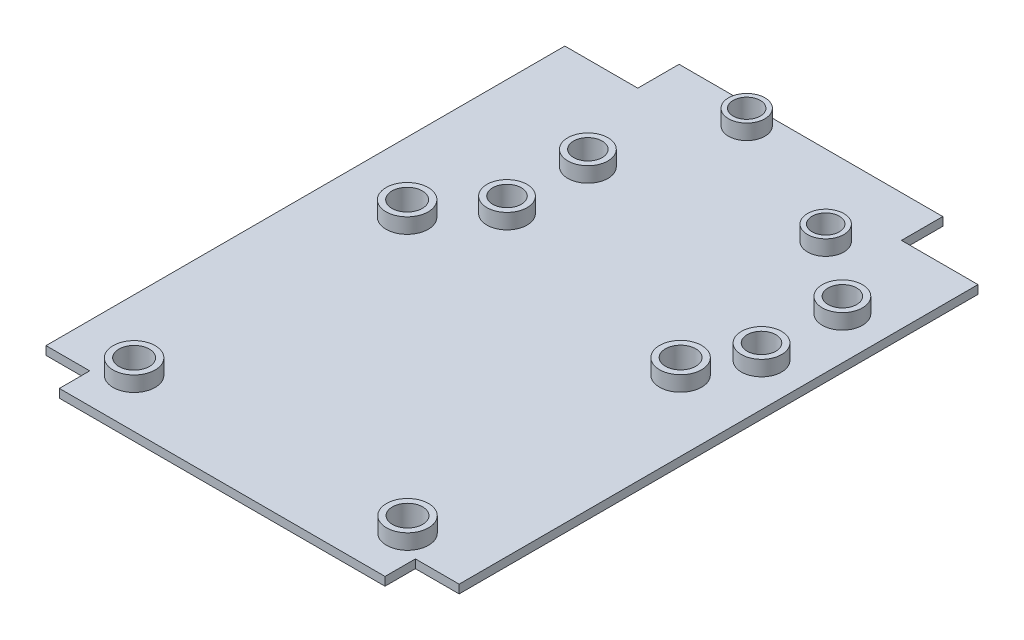
ISO-10303-21;
HEADER;
FILE_DESCRIPTION(('STEP AP214'),'2;1');
FILE_NAME('part.step','',(''),(''),'','','');
FILE_SCHEMA(('AUTOMOTIVE_DESIGN { 1 0 10303 214 1 1 1 1 }'));
ENDSEC;
DATA;
#1=APPLICATION_CONTEXT('core data for automotive mechanical design processes');
#2=APPLICATION_PROTOCOL_DEFINITION('international standard','automotive_design',2000,#1);
#3=PRODUCT_CONTEXT('',#1,'mechanical');
#4=PRODUCT('Part','Part','',(#3));
#5=PRODUCT_RELATED_PRODUCT_CATEGORY('part','',(#4));
#6=PRODUCT_DEFINITION_FORMATION('','',#4);
#7=PRODUCT_DEFINITION_CONTEXT('part definition',#1,'design');
#8=PRODUCT_DEFINITION('design','',#6,#7);
#9=PRODUCT_DEFINITION_SHAPE('','',#8);
#10=(LENGTH_UNIT() NAMED_UNIT(*) SI_UNIT(.MILLI.,.METRE.));
#11=(NAMED_UNIT(*) PLANE_ANGLE_UNIT() SI_UNIT($,.RADIAN.));
#12=(NAMED_UNIT(*) SI_UNIT($,.STERADIAN.) SOLID_ANGLE_UNIT());
#13=UNCERTAINTY_MEASURE_WITH_UNIT(LENGTH_MEASURE(1.E-05),#10,'distance_accuracy_value','');
#14=(GEOMETRIC_REPRESENTATION_CONTEXT(3) GLOBAL_UNCERTAINTY_ASSIGNED_CONTEXT((#13)) GLOBAL_UNIT_ASSIGNED_CONTEXT((#10,
#11,#12)) REPRESENTATION_CONTEXT('',''));
#15=CARTESIAN_POINT('',(0.,0.,0.));
#16=DIRECTION('',(0.,0.,1.));
#17=DIRECTION('',(1.,0.,0.));
#18=AXIS2_PLACEMENT_3D('',#15,#16,#17);
#19=CARTESIAN_POINT('',(0.,1.778,-66.8635890969195));
#20=DIRECTION('',(0.,0.,-1.));
#21=DIRECTION('',(-1.,0.,0.));
#22=AXIS2_PLACEMENT_3D('',#19,#20,#21);
#23=PLANE('',#22);
#24=DIRECTION('',(1.,0.,0.));
#25=VECTOR('',#24,1.);
#26=CARTESIAN_POINT('',(0.,0.,-66.8635890969195));
#27=LINE('',#26,#25);
#28=CARTESIAN_POINT('',(28.1251690179949,0.,-66.8635890969195));
#29=VERTEX_POINT('',#28);
#30=CARTESIAN_POINT('',(44.1271690179949,0.,-66.8635890969195));
#31=VERTEX_POINT('',#30);
#32=EDGE_CURVE('E168',#29,#31,#27,.T.);
#33=ORIENTED_EDGE('',*,*,#32,.F.);
#34=DIRECTION('',(0.,-1.,0.));
#35=VECTOR('',#34,1.);
#36=CARTESIAN_POINT('',(28.1251690179949,1.778,-66.8635890969195));
#37=LINE('',#36,#35);
#38=CARTESIAN_POINT('',(28.1251690179949,1.778,-66.8635890969195));
#39=VERTEX_POINT('',#38);
#40=EDGE_CURVE('E11',#39,#29,#37,.T.);
#41=ORIENTED_EDGE('',*,*,#40,.F.);
#42=DIRECTION('',(1.,0.,0.));
#43=VECTOR('',#42,1.);
#44=CARTESIAN_POINT('',(0.,1.778,-66.8635890969195));
#45=LINE('',#44,#43);
#46=CARTESIAN_POINT('',(44.1271690179949,1.778,-66.8635890969195));
#47=VERTEX_POINT('',#46);
#48=EDGE_CURVE('E272',#39,#47,#45,.T.);
#49=ORIENTED_EDGE('',*,*,#48,.T.);
#50=DIRECTION('',(0.,-1.,0.));
#51=VECTOR('',#50,1.);
#52=CARTESIAN_POINT('',(44.1271690179949,1.778,-66.8635890969195));
#53=LINE('',#52,#51);
#54=EDGE_CURVE('E64',#47,#31,#53,.T.);
#55=ORIENTED_EDGE('',*,*,#54,.T.);
#56=EDGE_LOOP('',(#33,#41,#49,#55));
#57=FACE_BOUND('',#56,.T.);
#58=ADVANCED_FACE('F47',(#57),#23,.T.);
#59=CARTESIAN_POINT('',(28.1251690179949,1.778,0.));
#60=DIRECTION('',(1.,0.,0.));
#61=DIRECTION('',(0.,0.,-1.));
#62=AXIS2_PLACEMENT_3D('',#59,#60,#61);
#63=PLANE('',#62);
#64=DIRECTION('',(0.,0.,1.));
#65=VECTOR('',#64,1.);
#66=CARTESIAN_POINT('',(28.1251690179949,0.,0.));
#67=LINE('',#66,#65);
#68=CARTESIAN_POINT('',(28.1251690179949,0.,-75.4995890969195));
#69=VERTEX_POINT('',#68);
#70=EDGE_CURVE('E171',#69,#29,#67,.T.);
#71=ORIENTED_EDGE('',*,*,#70,.F.);
#72=DIRECTION('',(0.,-1.,0.));
#73=VECTOR('',#72,1.);
#74=CARTESIAN_POINT('',(28.1251690179949,1.778,-75.4995890969195));
#75=LINE('',#74,#73);
#76=CARTESIAN_POINT('',(28.1251690179949,1.778,-75.4995890969195));
#77=VERTEX_POINT('',#76);
#78=EDGE_CURVE('E56',#77,#69,#75,.T.);
#79=ORIENTED_EDGE('',*,*,#78,.F.);
#80=DIRECTION('',(0.,0.,1.));
#81=VECTOR('',#80,1.);
#82=CARTESIAN_POINT('',(28.1251690179949,1.778,0.));
#83=LINE('',#82,#81);
#84=EDGE_CURVE('E265',#77,#39,#83,.T.);
#85=ORIENTED_EDGE('',*,*,#84,.T.);
#86=ORIENTED_EDGE('',*,*,#40,.T.);
#87=EDGE_LOOP('',(#71,#79,#85,#86));
#88=FACE_BOUND('',#87,.T.);
#89=ADVANCED_FACE('F251',(#88),#63,.T.);
#90=CARTESIAN_POINT('',(0.,1.778,-75.4995890969195));
#91=DIRECTION('',(0.,0.,-1.));
#92=DIRECTION('',(-1.,0.,0.));
#93=AXIS2_PLACEMENT_3D('',#90,#91,#92);
#94=PLANE('',#93);
#95=DIRECTION('',(1.,0.,0.));
#96=VECTOR('',#95,1.);
#97=CARTESIAN_POINT('',(0.,0.,-75.4995890969195));
#98=LINE('',#97,#96);
#99=CARTESIAN_POINT('',(-26.9928309820051,0.,-75.4995890969195));
#100=VERTEX_POINT('',#99);
#101=EDGE_CURVE('E176',#100,#69,#98,.T.);
#102=ORIENTED_EDGE('',*,*,#101,.F.);
#103=DIRECTION('',(0.,-1.,0.));
#104=VECTOR('',#103,1.);
#105=CARTESIAN_POINT('',(-26.9928309820051,1.778,-75.4995890969195));
#106=LINE('',#105,#104);
#107=CARTESIAN_POINT('',(-26.9928309820051,1.778,-75.4995890969195));
#108=VERTEX_POINT('',#107);
#109=EDGE_CURVE('E238',#108,#100,#106,.T.);
#110=ORIENTED_EDGE('',*,*,#109,.F.);
#111=DIRECTION('',(1.,0.,0.));
#112=VECTOR('',#111,1.);
#113=CARTESIAN_POINT('',(0.,1.778,-75.4995890969195));
#114=LINE('',#113,#112);
#115=EDGE_CURVE('E247',#108,#77,#114,.T.);
#116=ORIENTED_EDGE('',*,*,#115,.T.);
#117=ORIENTED_EDGE('',*,*,#78,.T.);
#118=EDGE_LOOP('',(#102,#110,#116,#117));
#119=FACE_BOUND('',#118,.T.);
#120=ADVANCED_FACE('F245',(#119),#94,.T.);
#121=CARTESIAN_POINT('',(-26.9928309820051,1.778,0.));
#122=DIRECTION('',(-1.,0.,0.));
#123=DIRECTION('',(0.,0.,1.));
#124=AXIS2_PLACEMENT_3D('',#121,#122,#123);
#125=PLANE('',#124);
#126=DIRECTION('',(0.,0.,-1.));
#127=VECTOR('',#126,1.);
#128=CARTESIAN_POINT('',(-26.9928309820051,0.,0.));
#129=LINE('',#128,#127);
#130=CARTESIAN_POINT('',(-26.9928309820051,0.,-66.8635890969195));
#131=VERTEX_POINT('',#130);
#132=EDGE_CURVE('E180',#131,#100,#129,.T.);
#133=ORIENTED_EDGE('',*,*,#132,.F.);
#134=DIRECTION('',(0.,-1.,0.));
#135=VECTOR('',#134,1.);
#136=CARTESIAN_POINT('',(-26.9928309820051,1.778,-66.8635890969195));
#137=LINE('',#136,#135);
#138=CARTESIAN_POINT('',(-26.9928309820051,1.778,-66.8635890969195));
#139=VERTEX_POINT('',#138);
#140=EDGE_CURVE('E235',#139,#131,#137,.T.);
#141=ORIENTED_EDGE('',*,*,#140,.F.);
#142=DIRECTION('',(0.,0.,-1.));
#143=VECTOR('',#142,1.);
#144=CARTESIAN_POINT('',(-26.9928309820051,1.778,0.));
#145=LINE('',#144,#143);
#146=EDGE_CURVE('E262',#139,#108,#145,.T.);
#147=ORIENTED_EDGE('',*,*,#146,.T.);
#148=ORIENTED_EDGE('',*,*,#109,.T.);
#149=EDGE_LOOP('',(#133,#141,#147,#148));
#150=FACE_BOUND('',#149,.T.);
#151=ADVANCED_FACE('F259',(#150),#125,.T.);
#152=CARTESIAN_POINT('',(0.,1.778,-66.8635890969195));
#153=DIRECTION('',(0.,0.,-1.));
#154=DIRECTION('',(-1.,0.,0.));
#155=AXIS2_PLACEMENT_3D('',#152,#153,#154);
#156=PLANE('',#155);
#157=DIRECTION('',(1.,0.,0.));
#158=VECTOR('',#157,1.);
#159=CARTESIAN_POINT('',(0.,0.,-66.8635890969195));
#160=LINE('',#159,#158);
#161=CARTESIAN_POINT('',(-42.2328309820051,0.,-66.8635890969195));
#162=VERTEX_POINT('',#161);
#163=EDGE_CURVE('E184',#162,#131,#160,.T.);
#164=ORIENTED_EDGE('',*,*,#163,.F.);
#165=DIRECTION('',(0.,-1.,0.));
#166=VECTOR('',#165,1.);
#167=CARTESIAN_POINT('',(-42.2328309820051,1.778,-66.8635890969195));
#168=LINE('',#167,#166);
#169=CARTESIAN_POINT('',(-42.2328309820051,1.778,-66.8635890969195));
#170=VERTEX_POINT('',#169);
#171=EDGE_CURVE('E232',#170,#162,#168,.T.);
#172=ORIENTED_EDGE('',*,*,#171,.F.);
#173=DIRECTION('',(1.,0.,0.));
#174=VECTOR('',#173,1.);
#175=CARTESIAN_POINT('',(0.,1.778,-66.8635890969195));
#176=LINE('',#175,#174);
#177=EDGE_CURVE('E270',#170,#139,#176,.T.);
#178=ORIENTED_EDGE('',*,*,#177,.T.);
#179=ORIENTED_EDGE('',*,*,#140,.T.);
#180=EDGE_LOOP('',(#164,#172,#178,#179));
#181=FACE_BOUND('',#180,.T.);
#182=ADVANCED_FACE('F317',(#181),#156,.T.);
#183=CARTESIAN_POINT('',(-42.2328309820051,1.778,0.));
#184=DIRECTION('',(1.,0.,0.));
#185=DIRECTION('',(0.,0.,-1.));
#186=AXIS2_PLACEMENT_3D('',#183,#184,#185);
#187=PLANE('',#186);
#188=DIRECTION('',(0.,0.,1.));
#189=VECTOR('',#188,1.);
#190=CARTESIAN_POINT('',(-42.2328309820051,0.,0.));
#191=LINE('',#190,#189);
#192=CARTESIAN_POINT('',(-42.2328309820051,0.,41.5944109030805));
#193=VERTEX_POINT('',#192);
#194=EDGE_CURVE('E188',#162,#193,#191,.T.);
#195=ORIENTED_EDGE('',*,*,#194,.T.);
#196=DIRECTION('',(0.,-1.,0.));
#197=VECTOR('',#196,1.);
#198=CARTESIAN_POINT('',(-42.2328309820051,1.778,41.5944109030805));
#199=LINE('',#198,#197);
#200=CARTESIAN_POINT('',(-42.2328309820051,1.778,41.5944109030805));
#201=VERTEX_POINT('',#200);
#202=EDGE_CURVE('E228',#201,#193,#199,.T.);
#203=ORIENTED_EDGE('',*,*,#202,.F.);
#204=DIRECTION('',(0.,0.,1.));
#205=VECTOR('',#204,1.);
#206=CARTESIAN_POINT('',(-42.2328309820051,1.778,0.));
#207=LINE('',#206,#205);
#208=EDGE_CURVE('E278',#170,#201,#207,.T.);
#209=ORIENTED_EDGE('',*,*,#208,.F.);
#210=ORIENTED_EDGE('',*,*,#171,.T.);
#211=EDGE_LOOP('',(#195,#203,#209,#210));
#212=FACE_BOUND('',#211,.T.);
#213=ADVANCED_FACE('F320',(#212),#187,.F.);
#214=CARTESIAN_POINT('',(0.,1.778,41.5944109030805));
#215=DIRECTION('',(0.,0.,-1.));
#216=DIRECTION('',(-1.,0.,0.));
#217=AXIS2_PLACEMENT_3D('',#214,#215,#216);
#218=PLANE('',#217);
#219=DIRECTION('',(1.,0.,0.));
#220=VECTOR('',#219,1.);
#221=CARTESIAN_POINT('',(0.,0.,41.5944109030805));
#222=LINE('',#221,#220);
#223=CARTESIAN_POINT('',(-33.0888309820051,0.,41.5944109030805));
#224=VERTEX_POINT('',#223);
#225=EDGE_CURVE('E192',#193,#224,#222,.T.);
#226=ORIENTED_EDGE('',*,*,#225,.T.);
#227=DIRECTION('',(0.,-1.,0.));
#228=VECTOR('',#227,1.);
#229=CARTESIAN_POINT('',(-33.0888309820051,1.778,41.5944109030805));
#230=LINE('',#229,#228);
#231=CARTESIAN_POINT('',(-33.0888309820051,1.778,41.5944109030805));
#232=VERTEX_POINT('',#231);
#233=EDGE_CURVE('E224',#232,#224,#230,.T.);
#234=ORIENTED_EDGE('',*,*,#233,.F.);
#235=DIRECTION('',(1.,0.,0.));
#236=VECTOR('',#235,1.);
#237=CARTESIAN_POINT('',(0.,1.778,41.5944109030805));
#238=LINE('',#237,#236);
#239=EDGE_CURVE('E282',#201,#232,#238,.T.);
#240=ORIENTED_EDGE('',*,*,#239,.F.);
#241=ORIENTED_EDGE('',*,*,#202,.T.);
#242=EDGE_LOOP('',(#226,#234,#240,#241));
#243=FACE_BOUND('',#242,.T.);
#244=ADVANCED_FACE('F324',(#243),#218,.F.);
#245=CARTESIAN_POINT('',(-33.0888309820051,1.778,0.));
#246=DIRECTION('',(1.,0.,0.));
#247=DIRECTION('',(0.,0.,-1.));
#248=AXIS2_PLACEMENT_3D('',#245,#246,#247);
#249=PLANE('',#248);
#250=DIRECTION('',(0.,0.,1.));
#251=VECTOR('',#250,1.);
#252=CARTESIAN_POINT('',(-33.0888309820051,0.,0.));
#253=LINE('',#252,#251);
#254=CARTESIAN_POINT('',(-33.0888309820051,0.,47.9444109030805));
#255=VERTEX_POINT('',#254);
#256=EDGE_CURVE('E196',#224,#255,#253,.T.);
#257=ORIENTED_EDGE('',*,*,#256,.T.);
#258=DIRECTION('',(0.,-1.,0.));
#259=VECTOR('',#258,1.);
#260=CARTESIAN_POINT('',(-33.0888309820051,1.778,47.9444109030805));
#261=LINE('',#260,#259);
#262=CARTESIAN_POINT('',(-33.0888309820051,1.778,47.9444109030805));
#263=VERTEX_POINT('',#262);
#264=EDGE_CURVE('E220',#263,#255,#261,.T.);
#265=ORIENTED_EDGE('',*,*,#264,.F.);
#266=DIRECTION('',(0.,0.,1.));
#267=VECTOR('',#266,1.);
#268=CARTESIAN_POINT('',(-33.0888309820051,1.778,0.));
#269=LINE('',#268,#267);
#270=EDGE_CURVE('E286',#232,#263,#269,.T.);
#271=ORIENTED_EDGE('',*,*,#270,.F.);
#272=ORIENTED_EDGE('',*,*,#233,.T.);
#273=EDGE_LOOP('',(#257,#265,#271,#272));
#274=FACE_BOUND('',#273,.T.);
#275=ADVANCED_FACE('F292',(#274),#249,.F.);
#276=CARTESIAN_POINT('',(0.,1.778,47.9444109030805));
#277=DIRECTION('',(0.,0.,-1.));
#278=DIRECTION('',(-1.,0.,0.));
#279=AXIS2_PLACEMENT_3D('',#276,#277,#278);
#280=PLANE('',#279);
#281=DIRECTION('',(1.,0.,0.));
#282=VECTOR('',#281,1.);
#283=CARTESIAN_POINT('',(0.,0.,47.9444109030805));
#284=LINE('',#283,#282);
#285=CARTESIAN_POINT('',(34.9831690179949,0.,47.9444109030805));
#286=VERTEX_POINT('',#285);
#287=EDGE_CURVE('E200',#255,#286,#284,.T.);
#288=ORIENTED_EDGE('',*,*,#287,.T.);
#289=DIRECTION('',(0.,-1.,0.));
#290=VECTOR('',#289,1.);
#291=CARTESIAN_POINT('',(34.9831690179949,1.778,47.9444109030805));
#292=LINE('',#291,#290);
#293=CARTESIAN_POINT('',(34.9831690179949,1.778,47.9444109030805));
#294=VERTEX_POINT('',#293);
#295=EDGE_CURVE('E158',#294,#286,#292,.T.);
#296=ORIENTED_EDGE('',*,*,#295,.F.);
#297=DIRECTION('',(1.,0.,0.));
#298=VECTOR('',#297,1.);
#299=CARTESIAN_POINT('',(0.,1.778,47.9444109030805));
#300=LINE('',#299,#298);
#301=EDGE_CURVE('E145',#263,#294,#300,.T.);
#302=ORIENTED_EDGE('',*,*,#301,.F.);
#303=ORIENTED_EDGE('',*,*,#264,.T.);
#304=EDGE_LOOP('',(#288,#296,#302,#303));
#305=FACE_BOUND('',#304,.T.);
#306=ADVANCED_FACE('F294',(#305),#280,.F.);
#307=CARTESIAN_POINT('',(34.9831690179949,1.778,0.));
#308=DIRECTION('',(-1.,0.,0.));
#309=DIRECTION('',(0.,0.,1.));
#310=AXIS2_PLACEMENT_3D('',#307,#308,#309);
#311=PLANE('',#310);
#312=DIRECTION('',(0.,0.,-1.));
#313=VECTOR('',#312,1.);
#314=CARTESIAN_POINT('',(34.9831690179949,0.,0.));
#315=LINE('',#314,#313);
#316=CARTESIAN_POINT('',(34.9831690179949,0.,41.5944109030805));
#317=VERTEX_POINT('',#316);
#318=EDGE_CURVE('E154',#286,#317,#315,.T.);
#319=ORIENTED_EDGE('',*,*,#318,.T.);
#320=DIRECTION('',(0.,-1.,0.));
#321=VECTOR('',#320,1.);
#322=CARTESIAN_POINT('',(34.9831690179949,1.778,41.5944109030805));
#323=LINE('',#322,#321);
#324=CARTESIAN_POINT('',(34.9831690179949,1.778,41.5944109030805));
#325=VERTEX_POINT('',#324);
#326=EDGE_CURVE('E152',#325,#317,#323,.T.);
#327=ORIENTED_EDGE('',*,*,#326,.F.);
#328=DIRECTION('',(0.,0.,-1.));
#329=VECTOR('',#328,1.);
#330=CARTESIAN_POINT('',(34.9831690179949,1.778,0.));
#331=LINE('',#330,#329);
#332=EDGE_CURVE('E138',#294,#325,#331,.T.);
#333=ORIENTED_EDGE('',*,*,#332,.F.);
#334=ORIENTED_EDGE('',*,*,#295,.T.);
#335=EDGE_LOOP('',(#319,#327,#333,#334));
#336=FACE_BOUND('',#335,.T.);
#337=ADVANCED_FACE('F153',(#336),#311,.F.);
#338=CARTESIAN_POINT('',(0.,1.778,41.5944109030805));
#339=DIRECTION('',(0.,0.,1.));
#340=DIRECTION('',(1.,0.,0.));
#341=AXIS2_PLACEMENT_3D('',#338,#339,#340);
#342=PLANE('',#341);
#343=DIRECTION('',(-1.,0.,0.));
#344=VECTOR('',#343,1.);
#345=CARTESIAN_POINT('',(0.,0.,41.5944109030805));
#346=LINE('',#345,#344);
#347=CARTESIAN_POINT('',(44.1271690179949,0.,41.5944109030805));
#348=VERTEX_POINT('',#347);
#349=EDGE_CURVE('E206',#348,#317,#346,.T.);
#350=ORIENTED_EDGE('',*,*,#349,.F.);
#351=DIRECTION('',(0.,-1.,0.));
#352=VECTOR('',#351,1.);
#353=CARTESIAN_POINT('',(44.1271690179949,1.778,41.5944109030805));
#354=LINE('',#353,#352);
#355=CARTESIAN_POINT('',(44.1271690179949,1.778,41.5944109030805));
#356=VERTEX_POINT('',#355);
#357=EDGE_CURVE('E101',#356,#348,#354,.T.);
#358=ORIENTED_EDGE('',*,*,#357,.F.);
#359=DIRECTION('',(-1.,0.,0.));
#360=VECTOR('',#359,1.);
#361=CARTESIAN_POINT('',(0.,1.778,41.5944109030805));
#362=LINE('',#361,#360);
#363=EDGE_CURVE('E143',#356,#325,#362,.T.);
#364=ORIENTED_EDGE('',*,*,#363,.T.);
#365=ORIENTED_EDGE('',*,*,#326,.T.);
#366=EDGE_LOOP('',(#350,#358,#364,#365));
#367=FACE_BOUND('',#366,.T.);
#368=ADVANCED_FACE('F160',(#367),#342,.T.);
#369=CARTESIAN_POINT('',(44.1271690179949,1.778,0.));
#370=DIRECTION('',(1.,0.,0.));
#371=DIRECTION('',(0.,0.,-1.));
#372=AXIS2_PLACEMENT_3D('',#369,#370,#371);
#373=PLANE('',#372);
#374=DIRECTION('',(0.,0.,1.));
#375=VECTOR('',#374,1.);
#376=CARTESIAN_POINT('',(44.1271690179949,0.,0.));
#377=LINE('',#376,#375);
#378=EDGE_CURVE('E209',#31,#348,#377,.T.);
#379=ORIENTED_EDGE('',*,*,#378,.F.);
#380=ORIENTED_EDGE('',*,*,#54,.F.);
#381=DIRECTION('',(0.,0.,1.));
#382=VECTOR('',#381,1.);
#383=CARTESIAN_POINT('',(44.1271690179949,1.778,0.));
#384=LINE('',#383,#382);
#385=EDGE_CURVE('E162',#47,#356,#384,.T.);
#386=ORIENTED_EDGE('',*,*,#385,.T.);
#387=ORIENTED_EDGE('',*,*,#357,.T.);
#388=EDGE_LOOP('',(#379,#380,#386,#387));
#389=FACE_BOUND('',#388,.T.);
#390=ADVANCED_FACE('F295',(#389),#373,.T.);
#391=CARTESIAN_POINT('',(0.,1.778,0.));
#392=DIRECTION('',(0.,1.,0.));
#393=DIRECTION('',(0.,0.,1.));
#394=AXIS2_PLACEMENT_3D('',#391,#392,#393);
#395=PLANE('',#394);
#396=CARTESIAN_POINT('',(20.4194704002233,1.778,-58.732825816466));
#397=DIRECTION('',(0.,1.,0.));
#398=DIRECTION('',(0.,0.,1.));
#399=AXIS2_PLACEMENT_3D('',#396,#397,#398);
#400=CIRCLE('',#399,3.8);
#401=CARTESIAN_POINT('',(20.4194704002233,1.778,-54.932825816466));
#402=VERTEX_POINT('',#401);
#403=EDGE_CURVE('E213',#402,#402,#400,.T.);
#404=ORIENTED_EDGE('',*,*,#403,.F.);
#405=EDGE_LOOP('',(#404));
#406=FACE_BOUND('',#405,.T.);
#407=CARTESIAN_POINT('',(-8.79052959977668,1.778,-71.432825816466));
#408=DIRECTION('',(0.,1.,0.));
#409=DIRECTION('',(0.,0.,1.));
#410=AXIS2_PLACEMENT_3D('',#407,#408,#409);
#411=CIRCLE('',#410,3.8);
#412=CARTESIAN_POINT('',(-8.79052959977668,1.778,-67.6328258164661));
#413=VERTEX_POINT('',#412);
#414=EDGE_CURVE('E827',#413,#413,#411,.T.);
#415=ORIENTED_EDGE('',*,*,#414,.F.);
#416=EDGE_LOOP('',(#415));
#417=FACE_BOUND('',#416,.T.);
#418=CARTESIAN_POINT('',(29.4284926342591,1.778,-19.3953863074132));
#419=DIRECTION('',(0.,1.,0.));
#420=DIRECTION('',(0.,0.,1.));
#421=AXIS2_PLACEMENT_3D('',#418,#419,#420);
#422=CIRCLE('',#421,4.40000000000001);
#423=CARTESIAN_POINT('',(29.4284926342591,1.778,-14.9953863074132));
#424=VERTEX_POINT('',#423);
#425=EDGE_CURVE('E831',#424,#424,#422,.T.);
#426=ORIENTED_EDGE('',*,*,#425,.F.);
#427=EDGE_LOOP('',(#426));
#428=FACE_BOUND('',#427,.T.);
#429=CARTESIAN_POINT('',(29.5072781068471,1.778,37.7646136925868));
#430=DIRECTION('',(0.,1.,0.));
#431=DIRECTION('',(0.,0.,1.));
#432=AXIS2_PLACEMENT_3D('',#429,#430,#431);
#433=CIRCLE('',#432,4.40000000000001);
#434=CARTESIAN_POINT('',(29.5072781068471,1.778,42.1646136925868));
#435=VERTEX_POINT('',#434);
#436=EDGE_CURVE('E835',#435,#435,#433,.T.);
#437=ORIENTED_EDGE('',*,*,#436,.F.);
#438=EDGE_LOOP('',(#437));
#439=FACE_BOUND('',#438,.T.);
#440=CARTESIAN_POINT('',(-27.6427832890102,1.778,37.7646136925868));
#441=DIRECTION('',(0.,1.,0.));
#442=DIRECTION('',(0.,0.,1.));
#443=AXIS2_PLACEMENT_3D('',#440,#441,#442);
#444=CIRCLE('',#443,4.4);
#445=CARTESIAN_POINT('',(-27.6427832890102,1.778,42.1646136925868));
#446=VERTEX_POINT('',#445);
#447=EDGE_CURVE('E839',#446,#446,#444,.T.);
#448=ORIENTED_EDGE('',*,*,#447,.F.);
#449=EDGE_LOOP('',(#448));
#450=FACE_BOUND('',#449,.T.);
#451=CARTESIAN_POINT('',(-27.7315687723412,1.778,-19.3953863074132));
#452=DIRECTION('',(0.,1.,0.));
#453=DIRECTION('',(0.,0.,1.));
#454=AXIS2_PLACEMENT_3D('',#451,#452,#453);
#455=CIRCLE('',#454,4.4);
#456=CARTESIAN_POINT('',(-27.7315687723412,1.778,-14.9953863074132));
#457=VERTEX_POINT('',#456);
#458=EDGE_CURVE('E843',#457,#457,#455,.T.);
#459=ORIENTED_EDGE('',*,*,#458,.F.);
#460=EDGE_LOOP('',(#459));
#461=FACE_BOUND('',#460,.T.);
#462=CARTESIAN_POINT('',(35.241316357595,1.778,-30.4948214789763));
#463=DIRECTION('',(0.,1.,0.));
#464=DIRECTION('',(0.,0.,1.));
#465=AXIS2_PLACEMENT_3D('',#462,#463,#464);
#466=CIRCLE('',#465,4.2);
#467=CARTESIAN_POINT('',(35.241316357595,1.778,-26.2948214789763));
#468=VERTEX_POINT('',#467);
#469=EDGE_CURVE('E847',#468,#468,#466,.T.);
#470=ORIENTED_EDGE('',*,*,#469,.F.);
#471=EDGE_LOOP('',(#470));
#472=FACE_BOUND('',#471,.T.);
#473=CARTESIAN_POINT('',(35.241316357595,1.778,-47.4036014789763));
#474=DIRECTION('',(0.,1.,0.));
#475=DIRECTION('',(0.,0.,1.));
#476=AXIS2_PLACEMENT_3D('',#473,#474,#475);
#477=CIRCLE('',#476,4.2);
#478=CARTESIAN_POINT('',(35.241316357595,1.778,-43.2036014789763));
#479=VERTEX_POINT('',#478);
#480=EDGE_CURVE('E851',#479,#479,#477,.T.);
#481=ORIENTED_EDGE('',*,*,#480,.F.);
#482=EDGE_LOOP('',(#481));
#483=FACE_BOUND('',#482,.T.);
#484=CARTESIAN_POINT('',(-17.958983642405,1.778,-30.4948214789763));
#485=DIRECTION('',(0.,1.,0.));
#486=DIRECTION('',(0.,0.,1.));
#487=AXIS2_PLACEMENT_3D('',#484,#485,#486);
#488=CIRCLE('',#487,4.2);
#489=CARTESIAN_POINT('',(-17.958983642405,1.778,-26.2948214789763));
#490=VERTEX_POINT('',#489);
#491=EDGE_CURVE('E855',#490,#490,#488,.T.);
#492=ORIENTED_EDGE('',*,*,#491,.F.);
#493=EDGE_LOOP('',(#492));
#494=FACE_BOUND('',#493,.T.);
#495=CARTESIAN_POINT('',(-17.958983642405,1.778,-47.4036014789763));
#496=DIRECTION('',(0.,1.,0.));
#497=DIRECTION('',(0.,0.,1.));
#498=AXIS2_PLACEMENT_3D('',#495,#496,#497);
#499=CIRCLE('',#498,4.2);
#500=CARTESIAN_POINT('',(-17.958983642405,1.778,-43.2036014789764));
#501=VERTEX_POINT('',#500);
#502=EDGE_CURVE('E859',#501,#501,#499,.T.);
#503=ORIENTED_EDGE('',*,*,#502,.F.);
#504=EDGE_LOOP('',(#503));
#505=FACE_BOUND('',#504,.T.);
#506=ORIENTED_EDGE('',*,*,#48,.F.);
#507=ORIENTED_EDGE('',*,*,#84,.F.);
#508=ORIENTED_EDGE('',*,*,#115,.F.);
#509=ORIENTED_EDGE('',*,*,#146,.F.);
#510=ORIENTED_EDGE('',*,*,#177,.F.);
#511=ORIENTED_EDGE('',*,*,#208,.T.);
#512=ORIENTED_EDGE('',*,*,#239,.T.);
#513=ORIENTED_EDGE('',*,*,#270,.T.);
#514=ORIENTED_EDGE('',*,*,#301,.T.);
#515=ORIENTED_EDGE('',*,*,#332,.T.);
#516=ORIENTED_EDGE('',*,*,#363,.F.);
#517=ORIENTED_EDGE('',*,*,#385,.F.);
#518=EDGE_LOOP('',(#506,#507,#508,#509,#510,#511,#512,#513,#514,#515,#516,#517));
#519=FACE_BOUND('',#518,.T.);
#520=ADVANCED_FACE('F140',(#406,#417,#428,#439,#450,#461,#472,#483,#494,#505,#519),#395,.T.);
#521=CARTESIAN_POINT('',(0.,0.,0.));
#522=DIRECTION('',(0.,1.,0.));
#523=DIRECTION('',(0.,0.,1.));
#524=AXIS2_PLACEMENT_3D('',#521,#522,#523);
#525=PLANE('',#524);
#526=ORIENTED_EDGE('',*,*,#32,.T.);
#527=ORIENTED_EDGE('',*,*,#378,.T.);
#528=ORIENTED_EDGE('',*,*,#349,.T.);
#529=ORIENTED_EDGE('',*,*,#318,.F.);
#530=ORIENTED_EDGE('',*,*,#287,.F.);
#531=ORIENTED_EDGE('',*,*,#256,.F.);
#532=ORIENTED_EDGE('',*,*,#225,.F.);
#533=ORIENTED_EDGE('',*,*,#194,.F.);
#534=ORIENTED_EDGE('',*,*,#163,.T.);
#535=ORIENTED_EDGE('',*,*,#132,.T.);
#536=ORIENTED_EDGE('',*,*,#101,.T.);
#537=ORIENTED_EDGE('',*,*,#70,.T.);
#538=EDGE_LOOP('',(#526,#527,#528,#529,#530,#531,#532,#533,#534,#535,#536,#537));
#539=FACE_BOUND('',#538,.T.);
#540=CARTESIAN_POINT('',(-27.6427832890102,0.,37.7646136925868));
#541=DIRECTION('',(0.,1.,0.));
#542=DIRECTION('',(0.,0.,1.));
#543=AXIS2_PLACEMENT_3D('',#540,#541,#542);
#544=CIRCLE('',#543,3.175);
#545=CARTESIAN_POINT('',(-27.6427832890102,0.,40.9396136925868));
#546=VERTEX_POINT('',#545);
#547=EDGE_CURVE('E810',#546,#546,#544,.T.);
#548=ORIENTED_EDGE('',*,*,#547,.T.);
#549=EDGE_LOOP('',(#548));
#550=FACE_BOUND('',#549,.T.);
#551=CARTESIAN_POINT('',(29.5072781068471,0.,37.7646136925868));
#552=DIRECTION('',(0.,1.,0.));
#553=DIRECTION('',(0.,0.,1.));
#554=AXIS2_PLACEMENT_3D('',#551,#552,#553);
#555=CIRCLE('',#554,3.175);
#556=CARTESIAN_POINT('',(29.5072781068471,0.,40.9396136925868));
#557=VERTEX_POINT('',#556);
#558=EDGE_CURVE('E798',#557,#557,#555,.T.);
#559=ORIENTED_EDGE('',*,*,#558,.T.);
#560=EDGE_LOOP('',(#559));
#561=FACE_BOUND('',#560,.T.);
#562=CARTESIAN_POINT('',(29.4284926342591,0.,-19.3953863074132));
#563=DIRECTION('',(0.,1.,0.));
#564=DIRECTION('',(0.,0.,1.));
#565=AXIS2_PLACEMENT_3D('',#562,#563,#564);
#566=CIRCLE('',#565,3.175);
#567=CARTESIAN_POINT('',(29.4284926342591,0.,-16.2203863074132));
#568=VERTEX_POINT('',#567);
#569=EDGE_CURVE('E786',#568,#568,#566,.T.);
#570=ORIENTED_EDGE('',*,*,#569,.T.);
#571=EDGE_LOOP('',(#570));
#572=FACE_BOUND('',#571,.T.);
#573=CARTESIAN_POINT('',(-27.7315687723412,0.,-19.3953863074132));
#574=DIRECTION('',(0.,1.,0.));
#575=DIRECTION('',(0.,0.,1.));
#576=AXIS2_PLACEMENT_3D('',#573,#574,#575);
#577=CIRCLE('',#576,3.175);
#578=CARTESIAN_POINT('',(-27.7315687723412,0.,-16.2203863074132));
#579=VERTEX_POINT('',#578);
#580=EDGE_CURVE('E774',#579,#579,#577,.T.);
#581=ORIENTED_EDGE('',*,*,#580,.T.);
#582=EDGE_LOOP('',(#581));
#583=FACE_BOUND('',#582,.T.);
#584=CARTESIAN_POINT('',(20.4194704002233,0.,-58.732825816466));
#585=DIRECTION('',(0.,1.,0.));
#586=DIRECTION('',(0.,0.,1.));
#587=AXIS2_PLACEMENT_3D('',#584,#585,#586);
#588=CIRCLE('',#587,2.84480000000001);
#589=CARTESIAN_POINT('',(20.4194704002233,0.,-55.888025816466));
#590=VERTEX_POINT('',#589);
#591=EDGE_CURVE('E762',#590,#590,#588,.T.);
#592=ORIENTED_EDGE('',*,*,#591,.T.);
#593=EDGE_LOOP('',(#592));
#594=FACE_BOUND('',#593,.T.);
#595=CARTESIAN_POINT('',(-17.958983642405,0.,-30.4948214789763));
#596=DIRECTION('',(0.,1.,0.));
#597=DIRECTION('',(0.,0.,1.));
#598=AXIS2_PLACEMENT_3D('',#595,#596,#597);
#599=CIRCLE('',#598,3.);
#600=CARTESIAN_POINT('',(-17.958983642405,0.,-27.4948214789763));
#601=VERTEX_POINT('',#600);
#602=EDGE_CURVE('E750',#601,#601,#599,.T.);
#603=ORIENTED_EDGE('',*,*,#602,.T.);
#604=EDGE_LOOP('',(#603));
#605=FACE_BOUND('',#604,.T.);
#606=CARTESIAN_POINT('',(-8.79052959977668,0.,-71.432825816466));
#607=DIRECTION('',(0.,1.,0.));
#608=DIRECTION('',(0.,0.,1.));
#609=AXIS2_PLACEMENT_3D('',#606,#607,#608);
#610=CIRCLE('',#609,2.8448);
#611=CARTESIAN_POINT('',(-8.79052959977668,0.,-68.588025816466));
#612=VERTEX_POINT('',#611);
#613=EDGE_CURVE('E738',#612,#612,#610,.T.);
#614=ORIENTED_EDGE('',*,*,#613,.T.);
#615=EDGE_LOOP('',(#614));
#616=FACE_BOUND('',#615,.T.);
#617=CARTESIAN_POINT('',(-17.958983642405,0.,-47.4036014789763));
#618=DIRECTION('',(0.,1.,0.));
#619=DIRECTION('',(0.,0.,1.));
#620=AXIS2_PLACEMENT_3D('',#617,#618,#619);
#621=CIRCLE('',#620,3.);
#622=CARTESIAN_POINT('',(-17.958983642405,0.,-44.4036014789763));
#623=VERTEX_POINT('',#622);
#624=EDGE_CURVE('E728',#623,#623,#621,.T.);
#625=ORIENTED_EDGE('',*,*,#624,.T.);
#626=EDGE_LOOP('',(#625));
#627=FACE_BOUND('',#626,.T.);
#628=CARTESIAN_POINT('',(35.241316357595,0.,-30.4948214789763));
#629=DIRECTION('',(0.,1.,0.));
#630=DIRECTION('',(0.,0.,1.));
#631=AXIS2_PLACEMENT_3D('',#628,#629,#630);
#632=CIRCLE('',#631,3.);
#633=CARTESIAN_POINT('',(35.241316357595,0.,-27.4948214789763));
#634=VERTEX_POINT('',#633);
#635=EDGE_CURVE('E709',#634,#634,#632,.T.);
#636=ORIENTED_EDGE('',*,*,#635,.T.);
#637=EDGE_LOOP('',(#636));
#638=FACE_BOUND('',#637,.T.);
#639=CARTESIAN_POINT('',(35.241316357595,0.,-47.4036014789763));
#640=DIRECTION('',(0.,1.,0.));
#641=DIRECTION('',(0.,0.,1.));
#642=AXIS2_PLACEMENT_3D('',#639,#640,#641);
#643=CIRCLE('',#642,3.);
#644=CARTESIAN_POINT('',(35.241316357595,0.,-44.4036014789763));
#645=VERTEX_POINT('',#644);
#646=EDGE_CURVE('E716',#645,#645,#643,.T.);
#647=ORIENTED_EDGE('',*,*,#646,.T.);
#648=EDGE_LOOP('',(#647));
#649=FACE_BOUND('',#648,.T.);
#650=ADVANCED_FACE('F253',(#539,#550,#561,#572,#583,#594,#605,#616,#627,#638,#649),#525,.F.);
#651=CARTESIAN_POINT('',(-27.6427832890102,4.953,37.7646136925868));
#652=DIRECTION('',(0.,-1.,0.));
#653=DIRECTION('',(0.,0.,-1.));
#654=AXIS2_PLACEMENT_3D('',#651,#652,#653);
#655=CYLINDRICAL_SURFACE('',#654,3.175);
#656=CARTESIAN_POINT('',(-27.6427832890102,4.953,37.7646136925868));
#657=DIRECTION('',(0.,1.,0.));
#658=DIRECTION('',(0.,0.,1.));
#659=AXIS2_PLACEMENT_3D('',#656,#657,#658);
#660=CIRCLE('',#659,3.175);
#661=CARTESIAN_POINT('',(-27.6427832890102,4.953,40.9396136925868));
#662=VERTEX_POINT('',#661);
#663=EDGE_CURVE('E814',#662,#662,#660,.T.);
#664=ORIENTED_EDGE('',*,*,#663,.T.);
#665=EDGE_LOOP('',(#664));
#666=FACE_BOUND('',#665,.T.);
#667=ORIENTED_EDGE('',*,*,#547,.F.);
#668=EDGE_LOOP('',(#667));
#669=FACE_BOUND('',#668,.T.);
#670=ADVANCED_FACE('F363',(#666,#669),#655,.F.);
#671=CARTESIAN_POINT('',(-27.6427832890102,4.953,37.7646136925868));
#672=DIRECTION('',(0.,-1.,0.));
#673=DIRECTION('',(0.,0.,-1.));
#674=AXIS2_PLACEMENT_3D('',#671,#672,#673);
#675=CYLINDRICAL_SURFACE('',#674,4.4);
#676=ORIENTED_EDGE('',*,*,#447,.T.);
#677=EDGE_LOOP('',(#676));
#678=FACE_BOUND('',#677,.T.);
#679=CARTESIAN_POINT('',(-27.6427832890102,4.953,37.7646136925868));
#680=DIRECTION('',(0.,1.,0.));
#681=DIRECTION('',(0.,0.,1.));
#682=AXIS2_PLACEMENT_3D('',#679,#680,#681);
#683=CIRCLE('',#682,4.4);
#684=CARTESIAN_POINT('',(-27.6427832890102,4.953,42.1646136925868));
#685=VERTEX_POINT('',#684);
#686=EDGE_CURVE('E172',#685,#685,#683,.T.);
#687=ORIENTED_EDGE('',*,*,#686,.F.);
#688=EDGE_LOOP('',(#687));
#689=FACE_BOUND('',#688,.T.);
#690=ADVANCED_FACE('F404',(#678,#689),#675,.T.);
#691=CARTESIAN_POINT('',(0.,4.953,0.));
#692=DIRECTION('',(0.,1.,0.));
#693=DIRECTION('',(0.,0.,1.));
#694=AXIS2_PLACEMENT_3D('',#691,#692,#693);
#695=PLANE('',#694);
#696=ORIENTED_EDGE('',*,*,#663,.F.);
#697=EDGE_LOOP('',(#696));
#698=FACE_BOUND('',#697,.T.);
#699=ORIENTED_EDGE('',*,*,#686,.T.);
#700=EDGE_LOOP('',(#699));
#701=FACE_BOUND('',#700,.T.);
#702=ADVANCED_FACE('F414',(#698,#701),#695,.T.);
#703=CARTESIAN_POINT('',(29.5072781068471,4.953,37.7646136925868));
#704=DIRECTION('',(0.,-1.,0.));
#705=DIRECTION('',(0.,0.,-1.));
#706=AXIS2_PLACEMENT_3D('',#703,#704,#705);
#707=CYLINDRICAL_SURFACE('',#706,3.175);
#708=CARTESIAN_POINT('',(29.5072781068471,4.953,37.7646136925868));
#709=DIRECTION('',(0.,1.,0.));
#710=DIRECTION('',(0.,0.,1.));
#711=AXIS2_PLACEMENT_3D('',#708,#709,#710);
#712=CIRCLE('',#711,3.175);
#713=CARTESIAN_POINT('',(29.5072781068471,4.953,40.9396136925868));
#714=VERTEX_POINT('',#713);
#715=EDGE_CURVE('E802',#714,#714,#712,.T.);
#716=ORIENTED_EDGE('',*,*,#715,.T.);
#717=EDGE_LOOP('',(#716));
#718=FACE_BOUND('',#717,.T.);
#719=ORIENTED_EDGE('',*,*,#558,.F.);
#720=EDGE_LOOP('',(#719));
#721=FACE_BOUND('',#720,.T.);
#722=ADVANCED_FACE('F424',(#718,#721),#707,.F.);
#723=CARTESIAN_POINT('',(29.5072781068471,4.953,37.7646136925868));
#724=DIRECTION('',(0.,-1.,0.));
#725=DIRECTION('',(0.,0.,-1.));
#726=AXIS2_PLACEMENT_3D('',#723,#724,#725);
#727=CYLINDRICAL_SURFACE('',#726,4.40000000000001);
#728=ORIENTED_EDGE('',*,*,#436,.T.);
#729=EDGE_LOOP('',(#728));
#730=FACE_BOUND('',#729,.T.);
#731=CARTESIAN_POINT('',(29.5072781068471,4.953,37.7646136925868));
#732=DIRECTION('',(0.,1.,0.));
#733=DIRECTION('',(0.,0.,1.));
#734=AXIS2_PLACEMENT_3D('',#731,#732,#733);
#735=CIRCLE('',#734,4.40000000000001);
#736=CARTESIAN_POINT('',(29.5072781068471,4.953,42.1646136925868));
#737=VERTEX_POINT('',#736);
#738=EDGE_CURVE('E806',#737,#737,#735,.T.);
#739=ORIENTED_EDGE('',*,*,#738,.F.);
#740=EDGE_LOOP('',(#739));
#741=FACE_BOUND('',#740,.T.);
#742=ADVANCED_FACE('F434',(#730,#741),#727,.T.);
#743=CARTESIAN_POINT('',(0.,4.953,0.));
#744=DIRECTION('',(0.,1.,0.));
#745=DIRECTION('',(0.,0.,1.));
#746=AXIS2_PLACEMENT_3D('',#743,#744,#745);
#747=PLANE('',#746);
#748=ORIENTED_EDGE('',*,*,#715,.F.);
#749=EDGE_LOOP('',(#748));
#750=FACE_BOUND('',#749,.T.);
#751=ORIENTED_EDGE('',*,*,#738,.T.);
#752=EDGE_LOOP('',(#751));
#753=FACE_BOUND('',#752,.T.);
#754=ADVANCED_FACE('F444',(#750,#753),#747,.T.);
#755=CARTESIAN_POINT('',(29.4284926342591,4.953,-19.3953863074132));
#756=DIRECTION('',(0.,-1.,0.));
#757=DIRECTION('',(0.,0.,-1.));
#758=AXIS2_PLACEMENT_3D('',#755,#756,#757);
#759=CYLINDRICAL_SURFACE('',#758,3.175);
#760=CARTESIAN_POINT('',(29.4284926342591,4.953,-19.3953863074132));
#761=DIRECTION('',(0.,1.,0.));
#762=DIRECTION('',(0.,0.,1.));
#763=AXIS2_PLACEMENT_3D('',#760,#761,#762);
#764=CIRCLE('',#763,3.175);
#765=CARTESIAN_POINT('',(29.4284926342591,4.953,-16.2203863074132));
#766=VERTEX_POINT('',#765);
#767=EDGE_CURVE('E790',#766,#766,#764,.T.);
#768=ORIENTED_EDGE('',*,*,#767,.T.);
#769=EDGE_LOOP('',(#768));
#770=FACE_BOUND('',#769,.T.);
#771=ORIENTED_EDGE('',*,*,#569,.F.);
#772=EDGE_LOOP('',(#771));
#773=FACE_BOUND('',#772,.T.);
#774=ADVANCED_FACE('F454',(#770,#773),#759,.F.);
#775=CARTESIAN_POINT('',(29.4284926342591,4.953,-19.3953863074132));
#776=DIRECTION('',(0.,-1.,0.));
#777=DIRECTION('',(0.,0.,-1.));
#778=AXIS2_PLACEMENT_3D('',#775,#776,#777);
#779=CYLINDRICAL_SURFACE('',#778,4.40000000000001);
#780=ORIENTED_EDGE('',*,*,#425,.T.);
#781=EDGE_LOOP('',(#780));
#782=FACE_BOUND('',#781,.T.);
#783=CARTESIAN_POINT('',(29.4284926342591,4.953,-19.3953863074132));
#784=DIRECTION('',(0.,1.,0.));
#785=DIRECTION('',(0.,0.,1.));
#786=AXIS2_PLACEMENT_3D('',#783,#784,#785);
#787=CIRCLE('',#786,4.40000000000001);
#788=CARTESIAN_POINT('',(29.4284926342591,4.953,-14.9953863074132));
#789=VERTEX_POINT('',#788);
#790=EDGE_CURVE('E794',#789,#789,#787,.T.);
#791=ORIENTED_EDGE('',*,*,#790,.F.);
#792=EDGE_LOOP('',(#791));
#793=FACE_BOUND('',#792,.T.);
#794=ADVANCED_FACE('F464',(#782,#793),#779,.T.);
#795=CARTESIAN_POINT('',(0.,4.953,0.));
#796=DIRECTION('',(0.,1.,0.));
#797=DIRECTION('',(0.,0.,1.));
#798=AXIS2_PLACEMENT_3D('',#795,#796,#797);
#799=PLANE('',#798);
#800=ORIENTED_EDGE('',*,*,#767,.F.);
#801=EDGE_LOOP('',(#800));
#802=FACE_BOUND('',#801,.T.);
#803=ORIENTED_EDGE('',*,*,#790,.T.);
#804=EDGE_LOOP('',(#803));
#805=FACE_BOUND('',#804,.T.);
#806=ADVANCED_FACE('F474',(#802,#805),#799,.T.);
#807=CARTESIAN_POINT('',(-27.7315687723412,4.953,-19.3953863074132));
#808=DIRECTION('',(0.,-1.,0.));
#809=DIRECTION('',(0.,0.,-1.));
#810=AXIS2_PLACEMENT_3D('',#807,#808,#809);
#811=CYLINDRICAL_SURFACE('',#810,3.175);
#812=CARTESIAN_POINT('',(-27.7315687723412,4.953,-19.3953863074132));
#813=DIRECTION('',(0.,1.,0.));
#814=DIRECTION('',(0.,0.,1.));
#815=AXIS2_PLACEMENT_3D('',#812,#813,#814);
#816=CIRCLE('',#815,3.175);
#817=CARTESIAN_POINT('',(-27.7315687723412,4.953,-16.2203863074132));
#818=VERTEX_POINT('',#817);
#819=EDGE_CURVE('E778',#818,#818,#816,.T.);
#820=ORIENTED_EDGE('',*,*,#819,.T.);
#821=EDGE_LOOP('',(#820));
#822=FACE_BOUND('',#821,.T.);
#823=ORIENTED_EDGE('',*,*,#580,.F.);
#824=EDGE_LOOP('',(#823));
#825=FACE_BOUND('',#824,.T.);
#826=ADVANCED_FACE('F484',(#822,#825),#811,.F.);
#827=CARTESIAN_POINT('',(-27.7315687723412,4.953,-19.3953863074132));
#828=DIRECTION('',(0.,-1.,0.));
#829=DIRECTION('',(0.,0.,-1.));
#830=AXIS2_PLACEMENT_3D('',#827,#828,#829);
#831=CYLINDRICAL_SURFACE('',#830,4.4);
#832=ORIENTED_EDGE('',*,*,#458,.T.);
#833=EDGE_LOOP('',(#832));
#834=FACE_BOUND('',#833,.T.);
#835=CARTESIAN_POINT('',(-27.7315687723412,4.953,-19.3953863074132));
#836=DIRECTION('',(0.,1.,0.));
#837=DIRECTION('',(0.,0.,1.));
#838=AXIS2_PLACEMENT_3D('',#835,#836,#837);
#839=CIRCLE('',#838,4.4);
#840=CARTESIAN_POINT('',(-27.7315687723412,4.953,-14.9953863074132));
#841=VERTEX_POINT('',#840);
#842=EDGE_CURVE('E782',#841,#841,#839,.T.);
#843=ORIENTED_EDGE('',*,*,#842,.F.);
#844=EDGE_LOOP('',(#843));
#845=FACE_BOUND('',#844,.T.);
#846=ADVANCED_FACE('F494',(#834,#845),#831,.T.);
#847=CARTESIAN_POINT('',(0.,4.953,0.));
#848=DIRECTION('',(0.,1.,0.));
#849=DIRECTION('',(0.,0.,1.));
#850=AXIS2_PLACEMENT_3D('',#847,#848,#849);
#851=PLANE('',#850);
#852=ORIENTED_EDGE('',*,*,#819,.F.);
#853=EDGE_LOOP('',(#852));
#854=FACE_BOUND('',#853,.T.);
#855=ORIENTED_EDGE('',*,*,#842,.T.);
#856=EDGE_LOOP('',(#855));
#857=FACE_BOUND('',#856,.T.);
#858=ADVANCED_FACE('F504',(#854,#857),#851,.T.);
#859=CARTESIAN_POINT('',(20.4194704002233,4.953,-58.732825816466));
#860=DIRECTION('',(0.,-1.,0.));
#861=DIRECTION('',(0.,0.,-1.));
#862=AXIS2_PLACEMENT_3D('',#859,#860,#861);
#863=CYLINDRICAL_SURFACE('',#862,2.84480000000001);
#864=CARTESIAN_POINT('',(20.4194704002233,4.953,-58.732825816466));
#865=DIRECTION('',(0.,1.,0.));
#866=DIRECTION('',(0.,0.,1.));
#867=AXIS2_PLACEMENT_3D('',#864,#865,#866);
#868=CIRCLE('',#867,2.84480000000001);
#869=CARTESIAN_POINT('',(20.4194704002233,4.953,-55.888025816466));
#870=VERTEX_POINT('',#869);
#871=EDGE_CURVE('E766',#870,#870,#868,.T.);
#872=ORIENTED_EDGE('',*,*,#871,.T.);
#873=EDGE_LOOP('',(#872));
#874=FACE_BOUND('',#873,.T.);
#875=ORIENTED_EDGE('',*,*,#591,.F.);
#876=EDGE_LOOP('',(#875));
#877=FACE_BOUND('',#876,.T.);
#878=ADVANCED_FACE('F514',(#874,#877),#863,.F.);
#879=CARTESIAN_POINT('',(20.4194704002233,4.953,-58.732825816466));
#880=DIRECTION('',(0.,-1.,0.));
#881=DIRECTION('',(0.,0.,-1.));
#882=AXIS2_PLACEMENT_3D('',#879,#880,#881);
#883=CYLINDRICAL_SURFACE('',#882,3.8);
#884=ORIENTED_EDGE('',*,*,#403,.T.);
#885=EDGE_LOOP('',(#884));
#886=FACE_BOUND('',#885,.T.);
#887=CARTESIAN_POINT('',(20.4194704002233,4.953,-58.732825816466));
#888=DIRECTION('',(0.,1.,0.));
#889=DIRECTION('',(0.,0.,1.));
#890=AXIS2_PLACEMENT_3D('',#887,#888,#889);
#891=CIRCLE('',#890,3.8);
#892=CARTESIAN_POINT('',(20.4194704002233,4.953,-54.932825816466));
#893=VERTEX_POINT('',#892);
#894=EDGE_CURVE('E770',#893,#893,#891,.T.);
#895=ORIENTED_EDGE('',*,*,#894,.F.);
#896=EDGE_LOOP('',(#895));
#897=FACE_BOUND('',#896,.T.);
#898=ADVANCED_FACE('F524',(#886,#897),#883,.T.);
#899=CARTESIAN_POINT('',(0.,4.953,0.));
#900=DIRECTION('',(0.,1.,0.));
#901=DIRECTION('',(0.,0.,1.));
#902=AXIS2_PLACEMENT_3D('',#899,#900,#901);
#903=PLANE('',#902);
#904=ORIENTED_EDGE('',*,*,#871,.F.);
#905=EDGE_LOOP('',(#904));
#906=FACE_BOUND('',#905,.T.);
#907=ORIENTED_EDGE('',*,*,#894,.T.);
#908=EDGE_LOOP('',(#907));
#909=FACE_BOUND('',#908,.T.);
#910=ADVANCED_FACE('F534',(#906,#909),#903,.T.);
#911=CARTESIAN_POINT('',(-17.958983642405,4.953,-30.4948214789763));
#912=DIRECTION('',(0.,-1.,0.));
#913=DIRECTION('',(0.,0.,-1.));
#914=AXIS2_PLACEMENT_3D('',#911,#912,#913);
#915=CYLINDRICAL_SURFACE('',#914,3.);
#916=CARTESIAN_POINT('',(-17.958983642405,4.953,-30.4948214789763));
#917=DIRECTION('',(0.,1.,0.));
#918=DIRECTION('',(0.,0.,1.));
#919=AXIS2_PLACEMENT_3D('',#916,#917,#918);
#920=CIRCLE('',#919,3.);
#921=CARTESIAN_POINT('',(-17.958983642405,4.953,-27.4948214789763));
#922=VERTEX_POINT('',#921);
#923=EDGE_CURVE('E754',#922,#922,#920,.T.);
#924=ORIENTED_EDGE('',*,*,#923,.T.);
#925=EDGE_LOOP('',(#924));
#926=FACE_BOUND('',#925,.T.);
#927=ORIENTED_EDGE('',*,*,#602,.F.);
#928=EDGE_LOOP('',(#927));
#929=FACE_BOUND('',#928,.T.);
#930=ADVANCED_FACE('F544',(#926,#929),#915,.F.);
#931=CARTESIAN_POINT('',(-17.958983642405,4.953,-30.4948214789763));
#932=DIRECTION('',(0.,-1.,0.));
#933=DIRECTION('',(0.,0.,-1.));
#934=AXIS2_PLACEMENT_3D('',#931,#932,#933);
#935=CYLINDRICAL_SURFACE('',#934,4.2);
#936=ORIENTED_EDGE('',*,*,#491,.T.);
#937=EDGE_LOOP('',(#936));
#938=FACE_BOUND('',#937,.T.);
#939=CARTESIAN_POINT('',(-17.958983642405,4.953,-30.4948214789763));
#940=DIRECTION('',(0.,1.,0.));
#941=DIRECTION('',(0.,0.,1.));
#942=AXIS2_PLACEMENT_3D('',#939,#940,#941);
#943=CIRCLE('',#942,4.2);
#944=CARTESIAN_POINT('',(-17.958983642405,4.953,-26.2948214789763));
#945=VERTEX_POINT('',#944);
#946=EDGE_CURVE('E758',#945,#945,#943,.T.);
#947=ORIENTED_EDGE('',*,*,#946,.F.);
#948=EDGE_LOOP('',(#947));
#949=FACE_BOUND('',#948,.T.);
#950=ADVANCED_FACE('F554',(#938,#949),#935,.T.);
#951=CARTESIAN_POINT('',(0.,4.953,0.));
#952=DIRECTION('',(0.,1.,0.));
#953=DIRECTION('',(0.,0.,1.));
#954=AXIS2_PLACEMENT_3D('',#951,#952,#953);
#955=PLANE('',#954);
#956=ORIENTED_EDGE('',*,*,#923,.F.);
#957=EDGE_LOOP('',(#956));
#958=FACE_BOUND('',#957,.T.);
#959=ORIENTED_EDGE('',*,*,#946,.T.);
#960=EDGE_LOOP('',(#959));
#961=FACE_BOUND('',#960,.T.);
#962=ADVANCED_FACE('F564',(#958,#961),#955,.T.);
#963=CARTESIAN_POINT('',(-8.79052959977668,4.953,-71.432825816466));
#964=DIRECTION('',(0.,-1.,0.));
#965=DIRECTION('',(0.,0.,-1.));
#966=AXIS2_PLACEMENT_3D('',#963,#964,#965);
#967=CYLINDRICAL_SURFACE('',#966,2.8448);
#968=CARTESIAN_POINT('',(-8.79052959977668,4.953,-71.432825816466));
#969=DIRECTION('',(0.,1.,0.));
#970=DIRECTION('',(0.,0.,1.));
#971=AXIS2_PLACEMENT_3D('',#968,#969,#970);
#972=CIRCLE('',#971,2.8448);
#973=CARTESIAN_POINT('',(-8.79052959977668,4.953,-68.588025816466));
#974=VERTEX_POINT('',#973);
#975=EDGE_CURVE('E742',#974,#974,#972,.T.);
#976=ORIENTED_EDGE('',*,*,#975,.T.);
#977=EDGE_LOOP('',(#976));
#978=FACE_BOUND('',#977,.T.);
#979=ORIENTED_EDGE('',*,*,#613,.F.);
#980=EDGE_LOOP('',(#979));
#981=FACE_BOUND('',#980,.T.);
#982=ADVANCED_FACE('F574',(#978,#981),#967,.F.);
#983=CARTESIAN_POINT('',(-8.79052959977668,4.953,-71.432825816466));
#984=DIRECTION('',(0.,-1.,0.));
#985=DIRECTION('',(0.,0.,-1.));
#986=AXIS2_PLACEMENT_3D('',#983,#984,#985);
#987=CYLINDRICAL_SURFACE('',#986,3.8);
#988=ORIENTED_EDGE('',*,*,#414,.T.);
#989=EDGE_LOOP('',(#988));
#990=FACE_BOUND('',#989,.T.);
#991=CARTESIAN_POINT('',(-8.79052959977668,4.953,-71.432825816466));
#992=DIRECTION('',(0.,1.,0.));
#993=DIRECTION('',(0.,0.,1.));
#994=AXIS2_PLACEMENT_3D('',#991,#992,#993);
#995=CIRCLE('',#994,3.8);
#996=CARTESIAN_POINT('',(-8.79052959977668,4.953,-67.6328258164661));
#997=VERTEX_POINT('',#996);
#998=EDGE_CURVE('E746',#997,#997,#995,.T.);
#999=ORIENTED_EDGE('',*,*,#998,.F.);
#1000=EDGE_LOOP('',(#999));
#1001=FACE_BOUND('',#1000,.T.);
#1002=ADVANCED_FACE('F584',(#990,#1001),#987,.T.);
#1003=CARTESIAN_POINT('',(0.,4.953,0.));
#1004=DIRECTION('',(0.,1.,0.));
#1005=DIRECTION('',(0.,0.,1.));
#1006=AXIS2_PLACEMENT_3D('',#1003,#1004,#1005);
#1007=PLANE('',#1006);
#1008=ORIENTED_EDGE('',*,*,#975,.F.);
#1009=EDGE_LOOP('',(#1008));
#1010=FACE_BOUND('',#1009,.T.);
#1011=ORIENTED_EDGE('',*,*,#998,.T.);
#1012=EDGE_LOOP('',(#1011));
#1013=FACE_BOUND('',#1012,.T.);
#1014=ADVANCED_FACE('F594',(#1010,#1013),#1007,.T.);
#1015=CARTESIAN_POINT('',(-17.958983642405,4.953,-47.4036014789763));
#1016=DIRECTION('',(0.,-1.,0.));
#1017=DIRECTION('',(0.,0.,-1.));
#1018=AXIS2_PLACEMENT_3D('',#1015,#1016,#1017);
#1019=CYLINDRICAL_SURFACE('',#1018,3.);
#1020=CARTESIAN_POINT('',(-17.958983642405,4.953,-47.4036014789763));
#1021=DIRECTION('',(0.,1.,0.));
#1022=DIRECTION('',(0.,0.,1.));
#1023=AXIS2_PLACEMENT_3D('',#1020,#1021,#1022);
#1024=CIRCLE('',#1023,3.);
#1025=CARTESIAN_POINT('',(-17.958983642405,4.953,-44.4036014789763));
#1026=VERTEX_POINT('',#1025);
#1027=EDGE_CURVE('E730',#1026,#1026,#1024,.T.);
#1028=ORIENTED_EDGE('',*,*,#1027,.T.);
#1029=EDGE_LOOP('',(#1028));
#1030=FACE_BOUND('',#1029,.T.);
#1031=ORIENTED_EDGE('',*,*,#624,.F.);
#1032=EDGE_LOOP('',(#1031));
#1033=FACE_BOUND('',#1032,.T.);
#1034=ADVANCED_FACE('F604',(#1030,#1033),#1019,.F.);
#1035=CARTESIAN_POINT('',(-17.958983642405,4.953,-47.4036014789763));
#1036=DIRECTION('',(0.,-1.,0.));
#1037=DIRECTION('',(0.,0.,-1.));
#1038=AXIS2_PLACEMENT_3D('',#1035,#1036,#1037);
#1039=CYLINDRICAL_SURFACE('',#1038,4.2);
#1040=ORIENTED_EDGE('',*,*,#502,.T.);
#1041=EDGE_LOOP('',(#1040));
#1042=FACE_BOUND('',#1041,.T.);
#1043=CARTESIAN_POINT('',(-17.958983642405,4.953,-47.4036014789763));
#1044=DIRECTION('',(0.,1.,0.));
#1045=DIRECTION('',(0.,0.,1.));
#1046=AXIS2_PLACEMENT_3D('',#1043,#1044,#1045);
#1047=CIRCLE('',#1046,4.2);
#1048=CARTESIAN_POINT('',(-17.958983642405,4.953,-43.2036014789764));
#1049=VERTEX_POINT('',#1048);
#1050=EDGE_CURVE('E734',#1049,#1049,#1047,.T.);
#1051=ORIENTED_EDGE('',*,*,#1050,.F.);
#1052=EDGE_LOOP('',(#1051));
#1053=FACE_BOUND('',#1052,.T.);
#1054=ADVANCED_FACE('F617',(#1042,#1053),#1039,.T.);
#1055=CARTESIAN_POINT('',(0.,4.953,0.));
#1056=DIRECTION('',(0.,1.,0.));
#1057=DIRECTION('',(0.,0.,1.));
#1058=AXIS2_PLACEMENT_3D('',#1055,#1056,#1057);
#1059=PLANE('',#1058);
#1060=ORIENTED_EDGE('',*,*,#1027,.F.);
#1061=EDGE_LOOP('',(#1060));
#1062=FACE_BOUND('',#1061,.T.);
#1063=ORIENTED_EDGE('',*,*,#1050,.T.);
#1064=EDGE_LOOP('',(#1063));
#1065=FACE_BOUND('',#1064,.T.);
#1066=ADVANCED_FACE('F627',(#1062,#1065),#1059,.T.);
#1067=CARTESIAN_POINT('',(35.241316357595,4.953,-30.4948214789763));
#1068=DIRECTION('',(0.,-1.,0.));
#1069=DIRECTION('',(0.,0.,-1.));
#1070=AXIS2_PLACEMENT_3D('',#1067,#1068,#1069);
#1071=CYLINDRICAL_SURFACE('',#1070,3.);
#1072=CARTESIAN_POINT('',(35.241316357595,4.953,-30.4948214789763));
#1073=DIRECTION('',(0.,1.,0.));
#1074=DIRECTION('',(0.,0.,1.));
#1075=AXIS2_PLACEMENT_3D('',#1072,#1073,#1074);
#1076=CIRCLE('',#1075,3.);
#1077=CARTESIAN_POINT('',(35.241316357595,4.953,-27.4948214789763));
#1078=VERTEX_POINT('',#1077);
#1079=EDGE_CURVE('E714',#1078,#1078,#1076,.T.);
#1080=ORIENTED_EDGE('',*,*,#1079,.T.);
#1081=EDGE_LOOP('',(#1080));
#1082=FACE_BOUND('',#1081,.T.);
#1083=ORIENTED_EDGE('',*,*,#635,.F.);
#1084=EDGE_LOOP('',(#1083));
#1085=FACE_BOUND('',#1084,.T.);
#1086=ADVANCED_FACE('F637',(#1082,#1085),#1071,.F.);
#1087=CARTESIAN_POINT('',(35.241316357595,4.953,-30.4948214789763));
#1088=DIRECTION('',(0.,-1.,0.));
#1089=DIRECTION('',(0.,0.,-1.));
#1090=AXIS2_PLACEMENT_3D('',#1087,#1088,#1089);
#1091=CYLINDRICAL_SURFACE('',#1090,4.2);
#1092=ORIENTED_EDGE('',*,*,#469,.T.);
#1093=EDGE_LOOP('',(#1092));
#1094=FACE_BOUND('',#1093,.T.);
#1095=CARTESIAN_POINT('',(35.241316357595,4.953,-30.4948214789763));
#1096=DIRECTION('',(0.,1.,0.));
#1097=DIRECTION('',(0.,0.,1.));
#1098=AXIS2_PLACEMENT_3D('',#1095,#1096,#1097);
#1099=CIRCLE('',#1098,4.2);
#1100=CARTESIAN_POINT('',(35.241316357595,4.953,-26.2948214789763));
#1101=VERTEX_POINT('',#1100);
#1102=EDGE_CURVE('E725',#1101,#1101,#1099,.T.);
#1103=ORIENTED_EDGE('',*,*,#1102,.F.);
#1104=EDGE_LOOP('',(#1103));
#1105=FACE_BOUND('',#1104,.T.);
#1106=ADVANCED_FACE('F647',(#1094,#1105),#1091,.T.);
#1107=CARTESIAN_POINT('',(0.,4.953,0.));
#1108=DIRECTION('',(0.,1.,0.));
#1109=DIRECTION('',(0.,0.,1.));
#1110=AXIS2_PLACEMENT_3D('',#1107,#1108,#1109);
#1111=PLANE('',#1110);
#1112=ORIENTED_EDGE('',*,*,#1079,.F.);
#1113=EDGE_LOOP('',(#1112));
#1114=FACE_BOUND('',#1113,.T.);
#1115=ORIENTED_EDGE('',*,*,#1102,.T.);
#1116=EDGE_LOOP('',(#1115));
#1117=FACE_BOUND('',#1116,.T.);
#1118=ADVANCED_FACE('F657',(#1114,#1117),#1111,.T.);
#1119=CARTESIAN_POINT('',(35.241316357595,4.953,-47.4036014789763));
#1120=DIRECTION('',(0.,-1.,0.));
#1121=DIRECTION('',(0.,0.,-1.));
#1122=AXIS2_PLACEMENT_3D('',#1119,#1120,#1121);
#1123=CYLINDRICAL_SURFACE('',#1122,3.);
#1124=CARTESIAN_POINT('',(35.241316357595,4.953,-47.4036014789763));
#1125=DIRECTION('',(0.,1.,0.));
#1126=DIRECTION('',(0.,0.,1.));
#1127=AXIS2_PLACEMENT_3D('',#1124,#1125,#1126);
#1128=CIRCLE('',#1127,3.);
#1129=CARTESIAN_POINT('',(35.241316357595,4.953,-44.4036014789763));
#1130=VERTEX_POINT('',#1129);
#1131=EDGE_CURVE('E703',#1130,#1130,#1128,.T.);
#1132=ORIENTED_EDGE('',*,*,#1131,.T.);
#1133=EDGE_LOOP('',(#1132));
#1134=FACE_BOUND('',#1133,.T.);
#1135=ORIENTED_EDGE('',*,*,#646,.F.);
#1136=EDGE_LOOP('',(#1135));
#1137=FACE_BOUND('',#1136,.T.);
#1138=ADVANCED_FACE('F667',(#1134,#1137),#1123,.F.);
#1139=CARTESIAN_POINT('',(35.241316357595,4.953,-47.4036014789763));
#1140=DIRECTION('',(0.,-1.,0.));
#1141=DIRECTION('',(0.,0.,-1.));
#1142=AXIS2_PLACEMENT_3D('',#1139,#1140,#1141);
#1143=CYLINDRICAL_SURFACE('',#1142,4.2);
#1144=ORIENTED_EDGE('',*,*,#480,.T.);
#1145=EDGE_LOOP('',(#1144));
#1146=FACE_BOUND('',#1145,.T.);
#1147=CARTESIAN_POINT('',(35.241316357595,4.953,-47.4036014789763));
#1148=DIRECTION('',(0.,1.,0.));
#1149=DIRECTION('',(0.,0.,1.));
#1150=AXIS2_PLACEMENT_3D('',#1147,#1148,#1149);
#1151=CIRCLE('',#1150,4.2);
#1152=CARTESIAN_POINT('',(35.241316357595,4.953,-43.2036014789763));
#1153=VERTEX_POINT('',#1152);
#1154=EDGE_CURVE('E706',#1153,#1153,#1151,.T.);
#1155=ORIENTED_EDGE('',*,*,#1154,.F.);
#1156=EDGE_LOOP('',(#1155));
#1157=FACE_BOUND('',#1156,.T.);
#1158=ADVANCED_FACE('F677',(#1146,#1157),#1143,.T.);
#1159=CARTESIAN_POINT('',(0.,4.953,0.));
#1160=DIRECTION('',(0.,1.,0.));
#1161=DIRECTION('',(0.,0.,1.));
#1162=AXIS2_PLACEMENT_3D('',#1159,#1160,#1161);
#1163=PLANE('',#1162);
#1164=ORIENTED_EDGE('',*,*,#1131,.F.);
#1165=EDGE_LOOP('',(#1164));
#1166=FACE_BOUND('',#1165,.T.);
#1167=ORIENTED_EDGE('',*,*,#1154,.T.);
#1168=EDGE_LOOP('',(#1167));
#1169=FACE_BOUND('',#1168,.T.);
#1170=ADVANCED_FACE('F687',(#1166,#1169),#1163,.T.);
#1171=CLOSED_SHELL('',(#58,#89,#120,#151,#182,#213,#244,#275,#306,#337,#368,#390,#520,#650,#670,
#690,#702,#722,#742,#754,#774,#794,#806,#826,#846,#858,#878,#898,#910,#930,#950,#962,#982,#1002,
#1014,#1034,#1054,#1066,#1086,#1106,#1118,#1138,#1158,#1170));
#1172=MANIFOLD_SOLID_BREP('B2',#1171);
#1173=ADVANCED_BREP_SHAPE_REPRESENTATION('',(#18,#1172),#14);
#1174=SHAPE_DEFINITION_REPRESENTATION(#9,#1173);
ENDSEC;
END-ISO-10303-21;
